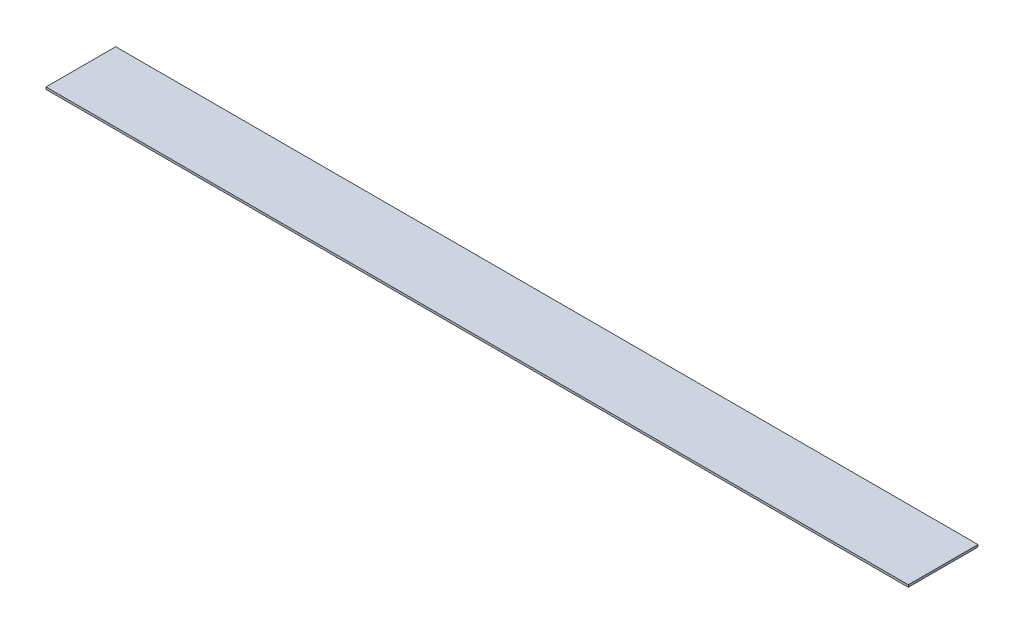
ISO-10303-21;
HEADER;
FILE_DESCRIPTION(('STEP AP214'),'2;1');
FILE_NAME('part.step','',(''),(''),'','','');
FILE_SCHEMA(('AUTOMOTIVE_DESIGN { 1 0 10303 214 1 1 1 1 }'));
ENDSEC;
DATA;
#1=APPLICATION_CONTEXT('core data for automotive mechanical design processes');
#2=APPLICATION_PROTOCOL_DEFINITION('international standard','automotive_design',2000,#1);
#3=PRODUCT_CONTEXT('',#1,'mechanical');
#4=PRODUCT('Part','Part','',(#3));
#5=PRODUCT_RELATED_PRODUCT_CATEGORY('part','',(#4));
#6=PRODUCT_DEFINITION_FORMATION('','',#4);
#7=PRODUCT_DEFINITION_CONTEXT('part definition',#1,'design');
#8=PRODUCT_DEFINITION('design','',#6,#7);
#9=PRODUCT_DEFINITION_SHAPE('','',#8);
#10=(LENGTH_UNIT() NAMED_UNIT(*) SI_UNIT(.MILLI.,.METRE.));
#11=(NAMED_UNIT(*) PLANE_ANGLE_UNIT() SI_UNIT($,.RADIAN.));
#12=(NAMED_UNIT(*) SI_UNIT($,.STERADIAN.) SOLID_ANGLE_UNIT());
#13=UNCERTAINTY_MEASURE_WITH_UNIT(LENGTH_MEASURE(1.E-05),#10,'distance_accuracy_value','');
#14=(GEOMETRIC_REPRESENTATION_CONTEXT(3) GLOBAL_UNCERTAINTY_ASSIGNED_CONTEXT((#13)) GLOBAL_UNIT_ASSIGNED_CONTEXT((#10,
#11,#12)) REPRESENTATION_CONTEXT('',''));
#15=CARTESIAN_POINT('',(0.,0.,0.));
#16=DIRECTION('',(0.,0.,1.));
#17=DIRECTION('',(1.,0.,0.));
#18=AXIS2_PLACEMENT_3D('',#15,#16,#17);
#19=CARTESIAN_POINT('',(0.,1.5875,0.));
#20=DIRECTION('',(1.,0.,0.));
#21=DIRECTION('',(0.,0.,-1.));
#22=AXIS2_PLACEMENT_3D('',#19,#20,#21);
#23=PLANE('',#22);
#24=DIRECTION('',(0.,0.,1.));
#25=VECTOR('',#24,1.);
#26=CARTESIAN_POINT('',(0.,0.,0.));
#27=LINE('',#26,#25);
#28=CARTESIAN_POINT('',(0.,0.,-50.8));
#29=VERTEX_POINT('',#28);
#30=CARTESIAN_POINT('',(0.,0.,0.));
#31=VERTEX_POINT('',#30);
#32=EDGE_CURVE('E101',#29,#31,#27,.T.);
#33=ORIENTED_EDGE('',*,*,#32,.T.);
#34=DIRECTION('',(0.,-1.,0.));
#35=VECTOR('',#34,1.);
#36=CARTESIAN_POINT('',(0.,1.5875,0.));
#37=LINE('',#36,#35);
#38=CARTESIAN_POINT('',(0.,1.5875,0.));
#39=VERTEX_POINT('',#38);
#40=EDGE_CURVE('E11',#39,#31,#37,.T.);
#41=ORIENTED_EDGE('',*,*,#40,.F.);
#42=DIRECTION('',(0.,0.,1.));
#43=VECTOR('',#42,1.);
#44=CARTESIAN_POINT('',(0.,1.5875,0.));
#45=LINE('',#44,#43);
#46=CARTESIAN_POINT('',(0.,1.5875,-50.8));
#47=VERTEX_POINT('',#46);
#48=EDGE_CURVE('E102',#47,#39,#45,.T.);
#49=ORIENTED_EDGE('',*,*,#48,.F.);
#50=DIRECTION('',(0.,-1.,0.));
#51=VECTOR('',#50,1.);
#52=CARTESIAN_POINT('',(0.,1.5875,-50.8));
#53=LINE('',#52,#51);
#54=EDGE_CURVE('E46',#47,#29,#53,.T.);
#55=ORIENTED_EDGE('',*,*,#54,.T.);
#56=EDGE_LOOP('',(#33,#41,#49,#55));
#57=FACE_BOUND('',#56,.T.);
#58=ADVANCED_FACE('F38',(#57),#23,.F.);
#59=CARTESIAN_POINT('',(0.,1.5875,0.));
#60=DIRECTION('',(0.,0.,-1.));
#61=DIRECTION('',(-1.,0.,0.));
#62=AXIS2_PLACEMENT_3D('',#59,#60,#61);
#63=PLANE('',#62);
#64=DIRECTION('',(1.,0.,0.));
#65=VECTOR('',#64,1.);
#66=CARTESIAN_POINT('',(0.,0.,0.));
#67=LINE('',#66,#65);
#68=CARTESIAN_POINT('',(628.65,0.,0.));
#69=VERTEX_POINT('',#68);
#70=EDGE_CURVE('E66',#31,#69,#67,.T.);
#71=ORIENTED_EDGE('',*,*,#70,.T.);
#72=DIRECTION('',(0.,-1.,0.));
#73=VECTOR('',#72,1.);
#74=CARTESIAN_POINT('',(628.65,0.,0.));
#75=LINE('',#74,#73);
#76=CARTESIAN_POINT('',(628.65,1.5875,0.));
#77=VERTEX_POINT('',#76);
#78=EDGE_CURVE('E93',#77,#69,#75,.T.);
#79=ORIENTED_EDGE('',*,*,#78,.F.);
#80=DIRECTION('',(1.,0.,0.));
#81=VECTOR('',#80,1.);
#82=CARTESIAN_POINT('',(0.,1.5875,0.));
#83=LINE('',#82,#81);
#84=EDGE_CURVE('E85',#39,#77,#83,.T.);
#85=ORIENTED_EDGE('',*,*,#84,.F.);
#86=ORIENTED_EDGE('',*,*,#40,.T.);
#87=EDGE_LOOP('',(#71,#79,#85,#86));
#88=FACE_BOUND('',#87,.T.);
#89=ADVANCED_FACE('F121',(#88),#63,.F.);
#90=CARTESIAN_POINT('',(0.,1.5875,-50.8));
#91=DIRECTION('',(0.,0.,1.));
#92=DIRECTION('',(1.,0.,0.));
#93=AXIS2_PLACEMENT_3D('',#90,#91,#92);
#94=PLANE('',#93);
#95=DIRECTION('',(-1.,0.,0.));
#96=VECTOR('',#95,1.);
#97=CARTESIAN_POINT('',(0.,0.,-50.8));
#98=LINE('',#97,#96);
#99=CARTESIAN_POINT('',(628.65,0.,-50.8));
#100=VERTEX_POINT('',#99);
#101=EDGE_CURVE('E70',#100,#29,#98,.T.);
#102=ORIENTED_EDGE('',*,*,#101,.T.);
#103=ORIENTED_EDGE('',*,*,#54,.F.);
#104=DIRECTION('',(-1.,0.,0.));
#105=VECTOR('',#104,1.);
#106=CARTESIAN_POINT('',(0.,1.5875,-50.8));
#107=LINE('',#106,#105);
#108=CARTESIAN_POINT('',(628.65,1.5875,-50.8));
#109=VERTEX_POINT('',#108);
#110=EDGE_CURVE('E54',#109,#47,#107,.T.);
#111=ORIENTED_EDGE('',*,*,#110,.F.);
#112=DIRECTION('',(0.,1.,0.));
#113=VECTOR('',#112,1.);
#114=CARTESIAN_POINT('',(628.65,0.,-50.8));
#115=LINE('',#114,#113);
#116=EDGE_CURVE('E82',#100,#109,#115,.T.);
#117=ORIENTED_EDGE('',*,*,#116,.F.);
#118=EDGE_LOOP('',(#102,#103,#111,#117));
#119=FACE_BOUND('',#118,.T.);
#120=ADVANCED_FACE('F80',(#119),#94,.F.);
#121=CARTESIAN_POINT('',(0.,1.5875,0.));
#122=DIRECTION('',(0.,-1.,0.));
#123=DIRECTION('',(0.,0.,-1.));
#124=AXIS2_PLACEMENT_3D('',#121,#122,#123);
#125=PLANE('',#124);
#126=ORIENTED_EDGE('',*,*,#48,.T.);
#127=ORIENTED_EDGE('',*,*,#84,.T.);
#128=DIRECTION('',(0.,0.,1.));
#129=VECTOR('',#128,1.);
#130=CARTESIAN_POINT('',(628.65,1.5875,-50.8));
#131=LINE('',#130,#129);
#132=EDGE_CURVE('E88',#109,#77,#131,.T.);
#133=ORIENTED_EDGE('',*,*,#132,.F.);
#134=ORIENTED_EDGE('',*,*,#110,.T.);
#135=EDGE_LOOP('',(#126,#127,#133,#134));
#136=FACE_BOUND('',#135,.T.);
#137=ADVANCED_FACE('F89',(#136),#125,.F.);
#138=CARTESIAN_POINT('',(0.,0.,0.));
#139=DIRECTION('',(0.,-1.,0.));
#140=DIRECTION('',(0.,0.,-1.));
#141=AXIS2_PLACEMENT_3D('',#138,#139,#140);
#142=PLANE('',#141);
#143=ORIENTED_EDGE('',*,*,#32,.F.);
#144=ORIENTED_EDGE('',*,*,#101,.F.);
#145=DIRECTION('',(0.,0.,-1.));
#146=VECTOR('',#145,1.);
#147=CARTESIAN_POINT('',(628.65,0.,-50.8));
#148=LINE('',#147,#146);
#149=EDGE_CURVE('E96',#69,#100,#148,.T.);
#150=ORIENTED_EDGE('',*,*,#149,.F.);
#151=ORIENTED_EDGE('',*,*,#70,.F.);
#152=EDGE_LOOP('',(#143,#144,#150,#151));
#153=FACE_BOUND('',#152,.T.);
#154=ADVANCED_FACE('F110',(#153),#142,.T.);
#155=CARTESIAN_POINT('',(628.65,0.,0.));
#156=DIRECTION('',(1.,0.,0.));
#157=DIRECTION('',(0.,0.,-1.));
#158=AXIS2_PLACEMENT_3D('',#155,#156,#157);
#159=PLANE('',#158);
#160=ORIENTED_EDGE('',*,*,#116,.T.);
#161=ORIENTED_EDGE('',*,*,#132,.T.);
#162=ORIENTED_EDGE('',*,*,#78,.T.);
#163=ORIENTED_EDGE('',*,*,#149,.T.);
#164=EDGE_LOOP('',(#160,#161,#162,#163));
#165=FACE_BOUND('',#164,.T.);
#166=ADVANCED_FACE('F95',(#165),#159,.T.);
#167=CLOSED_SHELL('',(#58,#89,#120,#137,#154,#166));
#168=MANIFOLD_SOLID_BREP('B2',#167);
#169=ADVANCED_BREP_SHAPE_REPRESENTATION('',(#18,#168),#14);
#170=SHAPE_DEFINITION_REPRESENTATION(#9,#169);
ENDSEC;
END-ISO-10303-21;
